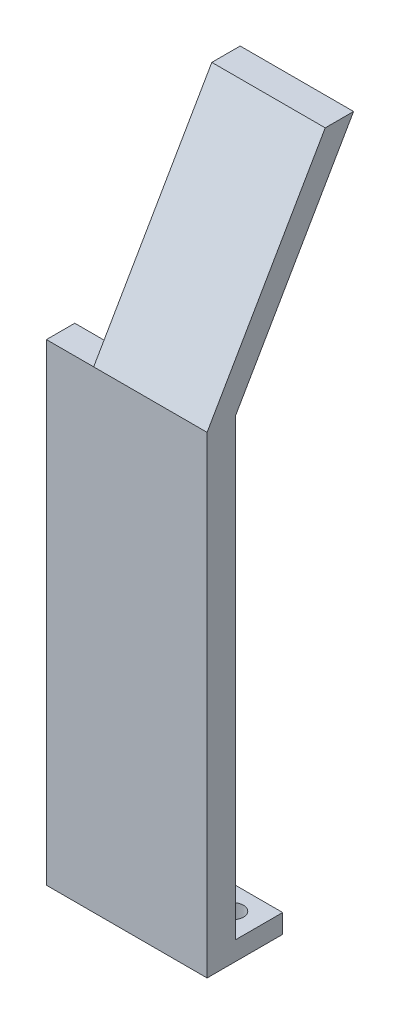
ISO-10303-21;
HEADER;
FILE_DESCRIPTION(('STEP AP214'),'2;1');
FILE_NAME('part.step','',(''),(''),'','','');
FILE_SCHEMA(('AUTOMOTIVE_DESIGN { 1 0 10303 214 1 1 1 1 }'));
ENDSEC;
DATA;
#1=APPLICATION_CONTEXT('core data for automotive mechanical design processes');
#2=APPLICATION_PROTOCOL_DEFINITION('international standard','automotive_design',2000,#1);
#3=PRODUCT_CONTEXT('',#1,'mechanical');
#4=PRODUCT('Part','Part','',(#3));
#5=PRODUCT_RELATED_PRODUCT_CATEGORY('part','',(#4));
#6=PRODUCT_DEFINITION_FORMATION('','',#4);
#7=PRODUCT_DEFINITION_CONTEXT('part definition',#1,'design');
#8=PRODUCT_DEFINITION('design','',#6,#7);
#9=PRODUCT_DEFINITION_SHAPE('','',#8);
#10=(LENGTH_UNIT() NAMED_UNIT(*) SI_UNIT(.MILLI.,.METRE.));
#11=(NAMED_UNIT(*) PLANE_ANGLE_UNIT() SI_UNIT($,.RADIAN.));
#12=(NAMED_UNIT(*) SI_UNIT($,.STERADIAN.) SOLID_ANGLE_UNIT());
#13=UNCERTAINTY_MEASURE_WITH_UNIT(LENGTH_MEASURE(1.E-05),#10,'distance_accuracy_value','');
#14=(GEOMETRIC_REPRESENTATION_CONTEXT(3) GLOBAL_UNCERTAINTY_ASSIGNED_CONTEXT((#13)) GLOBAL_UNIT_ASSIGNED_CONTEXT((#10,
#11,#12)) REPRESENTATION_CONTEXT('',''));
#15=CARTESIAN_POINT('',(0.,0.,0.));
#16=DIRECTION('',(0.,0.,1.));
#17=DIRECTION('',(1.,0.,0.));
#18=AXIS2_PLACEMENT_3D('',#15,#16,#17);
#19=CARTESIAN_POINT('',(0.,2.,0.));
#20=DIRECTION('',(0.,-1.,0.));
#21=DIRECTION('',(0.,0.,-1.));
#22=AXIS2_PLACEMENT_3D('',#19,#20,#21);
#23=PLANE('',#22);
#24=DIRECTION('',(0.,0.,-1.));
#25=VECTOR('',#24,1.);
#26=CARTESIAN_POINT('',(8.5,2.,2.5));
#27=LINE('',#26,#25);
#28=CARTESIAN_POINT('',(8.5,2.,2.5));
#29=VERTEX_POINT('',#28);
#30=CARTESIAN_POINT('',(8.5,2.,-2.5));
#31=VERTEX_POINT('',#30);
#32=EDGE_CURVE('E213',#29,#31,#27,.T.);
#33=ORIENTED_EDGE('',*,*,#32,.T.);
#34=DIRECTION('',(-1.,0.,0.));
#35=VECTOR('',#34,1.);
#36=CARTESIAN_POINT('',(-8.5,2.,-2.5));
#37=LINE('',#36,#35);
#38=CARTESIAN_POINT('',(-8.5,2.,-2.5));
#39=VERTEX_POINT('',#38);
#40=EDGE_CURVE('E81',#31,#39,#37,.T.);
#41=ORIENTED_EDGE('',*,*,#40,.T.);
#42=DIRECTION('',(0.,0.,1.));
#43=VECTOR('',#42,1.);
#44=CARTESIAN_POINT('',(-8.5,2.,2.5));
#45=LINE('',#44,#43);
#46=CARTESIAN_POINT('',(-8.5,2.,2.5));
#47=VERTEX_POINT('',#46);
#48=EDGE_CURVE('E219',#39,#47,#45,.T.);
#49=ORIENTED_EDGE('',*,*,#48,.T.);
#50=DIRECTION('',(1.,0.,0.));
#51=VECTOR('',#50,1.);
#52=CARTESIAN_POINT('',(-8.5,2.,2.5));
#53=LINE('',#52,#51);
#54=EDGE_CURVE('E223',#47,#29,#53,.T.);
#55=ORIENTED_EDGE('',*,*,#54,.T.);
#56=EDGE_LOOP('',(#33,#41,#49,#55));
#57=FACE_BOUND('',#56,.T.);
#58=CARTESIAN_POINT('',(5.75,2.,0.));
#59=DIRECTION('',(0.,1.,0.));
#60=DIRECTION('',(0.,0.,1.));
#61=AXIS2_PLACEMENT_3D('',#58,#59,#60);
#62=CIRCLE('',#61,1.1);
#63=CARTESIAN_POINT('',(5.75,2.,1.1));
#64=VERTEX_POINT('',#63);
#65=EDGE_CURVE('E205',#64,#64,#62,.T.);
#66=ORIENTED_EDGE('',*,*,#65,.F.);
#67=EDGE_LOOP('',(#66));
#68=FACE_BOUND('',#67,.T.);
#69=CARTESIAN_POINT('',(-5.75,2.,0.));
#70=DIRECTION('',(0.,1.,0.));
#71=DIRECTION('',(0.,0.,-1.));
#72=AXIS2_PLACEMENT_3D('',#69,#70,#71);
#73=CIRCLE('',#72,1.1);
#74=CARTESIAN_POINT('',(-5.75,2.,-1.1));
#75=VERTEX_POINT('',#74);
#76=EDGE_CURVE('E197',#75,#75,#73,.T.);
#77=ORIENTED_EDGE('',*,*,#76,.F.);
#78=EDGE_LOOP('',(#77));
#79=FACE_BOUND('',#78,.T.);
#80=CARTESIAN_POINT('',(0.,2.,0.));
#81=DIRECTION('',(0.,1.,0.));
#82=DIRECTION('',(0.,0.,1.));
#83=AXIS2_PLACEMENT_3D('',#80,#81,#82);
#84=CIRCLE('',#83,1.1);
#85=CARTESIAN_POINT('',(0.,2.,1.1));
#86=VERTEX_POINT('',#85);
#87=EDGE_CURVE('E189',#86,#86,#84,.T.);
#88=ORIENTED_EDGE('',*,*,#87,.F.);
#89=EDGE_LOOP('',(#88));
#90=FACE_BOUND('',#89,.T.);
#91=ADVANCED_FACE('F39',(#57,#68,#79,#90),#23,.F.);
#92=CARTESIAN_POINT('',(0.,0.,0.));
#93=DIRECTION('',(0.,-1.,0.));
#94=DIRECTION('',(0.,0.,-1.));
#95=AXIS2_PLACEMENT_3D('',#92,#93,#94);
#96=PLANE('',#95);
#97=CARTESIAN_POINT('',(-5.75,0.,0.));
#98=DIRECTION('',(0.,1.,0.));
#99=DIRECTION('',(0.,0.,-1.));
#100=AXIS2_PLACEMENT_3D('',#97,#98,#99);
#101=CIRCLE('',#100,1.1);
#102=CARTESIAN_POINT('',(-5.75,0.,-1.1));
#103=VERTEX_POINT('',#102);
#104=EDGE_CURVE('E193',#103,#103,#101,.T.);
#105=ORIENTED_EDGE('',*,*,#104,.T.);
#106=EDGE_LOOP('',(#105));
#107=FACE_BOUND('',#106,.T.);
#108=DIRECTION('',(0.,0.,-1.));
#109=VECTOR('',#108,1.);
#110=CARTESIAN_POINT('',(8.5,0.,2.5));
#111=LINE('',#110,#109);
#112=CARTESIAN_POINT('',(8.5,0.,5.5));
#113=VERTEX_POINT('',#112);
#114=CARTESIAN_POINT('',(8.5,0.,-2.5));
#115=VERTEX_POINT('',#114);
#116=EDGE_CURVE('E209',#113,#115,#111,.T.);
#117=ORIENTED_EDGE('',*,*,#116,.F.);
#118=DIRECTION('',(1.,0.,0.));
#119=VECTOR('',#118,1.);
#120=CARTESIAN_POINT('',(8.5,0.,5.5));
#121=LINE('',#120,#119);
#122=CARTESIAN_POINT('',(-8.5,0.,5.5));
#123=VERTEX_POINT('',#122);
#124=EDGE_CURVE('E158',#123,#113,#121,.T.);
#125=ORIENTED_EDGE('',*,*,#124,.F.);
#126=DIRECTION('',(0.,0.,1.));
#127=VECTOR('',#126,1.);
#128=CARTESIAN_POINT('',(-8.5,0.,2.5));
#129=LINE('',#128,#127);
#130=CARTESIAN_POINT('',(-8.5,0.,-2.5));
#131=VERTEX_POINT('',#130);
#132=EDGE_CURVE('E216',#131,#123,#129,.T.);
#133=ORIENTED_EDGE('',*,*,#132,.F.);
#134=DIRECTION('',(-1.,0.,0.));
#135=VECTOR('',#134,1.);
#136=CARTESIAN_POINT('',(-8.5,0.,-2.5));
#137=LINE('',#136,#135);
#138=EDGE_CURVE('E78',#115,#131,#137,.T.);
#139=ORIENTED_EDGE('',*,*,#138,.F.);
#140=EDGE_LOOP('',(#117,#125,#133,#139));
#141=FACE_BOUND('',#140,.T.);
#142=CARTESIAN_POINT('',(5.75,0.,0.));
#143=DIRECTION('',(0.,1.,0.));
#144=DIRECTION('',(0.,0.,1.));
#145=AXIS2_PLACEMENT_3D('',#142,#143,#144);
#146=CIRCLE('',#145,1.1);
#147=CARTESIAN_POINT('',(5.75,0.,1.1));
#148=VERTEX_POINT('',#147);
#149=EDGE_CURVE('E201',#148,#148,#146,.T.);
#150=ORIENTED_EDGE('',*,*,#149,.T.);
#151=EDGE_LOOP('',(#150));
#152=FACE_BOUND('',#151,.T.);
#153=CARTESIAN_POINT('',(0.,0.,0.));
#154=DIRECTION('',(0.,1.,0.));
#155=DIRECTION('',(0.,0.,1.));
#156=AXIS2_PLACEMENT_3D('',#153,#154,#155);
#157=CIRCLE('',#156,1.1);
#158=CARTESIAN_POINT('',(0.,0.,1.1));
#159=VERTEX_POINT('',#158);
#160=EDGE_CURVE('E188',#159,#159,#157,.T.);
#161=ORIENTED_EDGE('',*,*,#160,.T.);
#162=EDGE_LOOP('',(#161));
#163=FACE_BOUND('',#162,.T.);
#164=ADVANCED_FACE('F240',(#107,#141,#152,#163),#96,.T.);
#165=CARTESIAN_POINT('',(8.5,2.,2.5));
#166=DIRECTION('',(-1.,0.,0.));
#167=DIRECTION('',(0.,0.,1.));
#168=AXIS2_PLACEMENT_3D('',#165,#166,#167);
#169=PLANE('',#168);
#170=ORIENTED_EDGE('',*,*,#116,.T.);
#171=DIRECTION('',(0.,-1.,0.));
#172=VECTOR('',#171,1.);
#173=CARTESIAN_POINT('',(8.5,2.,-2.5));
#174=LINE('',#173,#172);
#175=EDGE_CURVE('E11',#31,#115,#174,.T.);
#176=ORIENTED_EDGE('',*,*,#175,.F.);
#177=ORIENTED_EDGE('',*,*,#32,.F.);
#178=DIRECTION('',(0.,-1.,0.));
#179=VECTOR('',#178,1.);
#180=CARTESIAN_POINT('',(8.5,50.,2.5));
#181=LINE('',#180,#179);
#182=CARTESIAN_POINT('',(8.5,50.,2.5));
#183=VERTEX_POINT('',#182);
#184=EDGE_CURVE('E64',#183,#29,#181,.T.);
#185=ORIENTED_EDGE('',*,*,#184,.F.);
#186=DIRECTION('',(0.,0.866025403784442,-0.499999999999995));
#187=VECTOR('',#186,1.);
#188=CARTESIAN_POINT('',(8.5,50.,2.5));
#189=LINE('',#188,#187);
#190=CARTESIAN_POINT('',(8.5,71.650635094611,-9.99999999999987));
#191=VERTEX_POINT('',#190);
#192=EDGE_CURVE('E147',#183,#191,#189,.T.);
#193=ORIENTED_EDGE('',*,*,#192,.T.);
#194=DIRECTION('',(0.,0.,1.));
#195=VECTOR('',#194,1.);
#196=CARTESIAN_POINT('',(8.5,71.650635094611,-6.99999999999987));
#197=LINE('',#196,#195);
#198=CARTESIAN_POINT('',(8.5,71.650635094611,-6.99999999999987));
#199=VERTEX_POINT('',#198);
#200=EDGE_CURVE('E124',#191,#199,#197,.T.);
#201=ORIENTED_EDGE('',*,*,#200,.T.);
#202=DIRECTION('',(0.,-0.866025403784442,0.499999999999995));
#203=VECTOR('',#202,1.);
#204=CARTESIAN_POINT('',(8.5,50.,5.5));
#205=LINE('',#204,#203);
#206=CARTESIAN_POINT('',(8.5,50.,5.5));
#207=VERTEX_POINT('',#206);
#208=EDGE_CURVE('E142',#199,#207,#205,.T.);
#209=ORIENTED_EDGE('',*,*,#208,.T.);
#210=DIRECTION('',(0.,-1.,0.));
#211=VECTOR('',#210,1.);
#212=CARTESIAN_POINT('',(8.5,50.,5.5));
#213=LINE('',#212,#211);
#214=EDGE_CURVE('E176',#207,#113,#213,.T.);
#215=ORIENTED_EDGE('',*,*,#214,.T.);
#216=EDGE_LOOP('',(#170,#176,#177,#185,#193,#201,#209,#215));
#217=FACE_BOUND('',#216,.T.);
#218=ADVANCED_FACE('F41',(#217),#169,.F.);
#219=CARTESIAN_POINT('',(-8.5,2.,-2.5));
#220=DIRECTION('',(0.,0.,1.));
#221=DIRECTION('',(1.,0.,0.));
#222=AXIS2_PLACEMENT_3D('',#219,#220,#221);
#223=PLANE('',#222);
#224=ORIENTED_EDGE('',*,*,#138,.T.);
#225=DIRECTION('',(0.,-1.,0.));
#226=VECTOR('',#225,1.);
#227=CARTESIAN_POINT('',(-8.5,2.,-2.5));
#228=LINE('',#227,#226);
#229=EDGE_CURVE('E48',#39,#131,#228,.T.);
#230=ORIENTED_EDGE('',*,*,#229,.F.);
#231=ORIENTED_EDGE('',*,*,#40,.F.);
#232=ORIENTED_EDGE('',*,*,#175,.T.);
#233=EDGE_LOOP('',(#224,#230,#231,#232));
#234=FACE_BOUND('',#233,.T.);
#235=ADVANCED_FACE('F261',(#234),#223,.F.);
#236=CARTESIAN_POINT('',(-8.5,2.,2.5));
#237=DIRECTION('',(1.,0.,0.));
#238=DIRECTION('',(0.,0.,-1.));
#239=AXIS2_PLACEMENT_3D('',#236,#237,#238);
#240=PLANE('',#239);
#241=ORIENTED_EDGE('',*,*,#132,.T.);
#242=DIRECTION('',(0.,-1.,0.));
#243=VECTOR('',#242,1.);
#244=CARTESIAN_POINT('',(-8.5,50.,5.5));
#245=LINE('',#244,#243);
#246=CARTESIAN_POINT('',(-8.5,50.,5.5));
#247=VERTEX_POINT('',#246);
#248=EDGE_CURVE('E180',#247,#123,#245,.T.);
#249=ORIENTED_EDGE('',*,*,#248,.F.);
#250=DIRECTION('',(0.,0.,1.));
#251=VECTOR('',#250,1.);
#252=CARTESIAN_POINT('',(-8.5,50.,2.5));
#253=LINE('',#252,#251);
#254=CARTESIAN_POINT('',(-8.5,50.,2.5));
#255=VERTEX_POINT('',#254);
#256=EDGE_CURVE('E163',#255,#247,#253,.T.);
#257=ORIENTED_EDGE('',*,*,#256,.F.);
#258=DIRECTION('',(0.,-1.,0.));
#259=VECTOR('',#258,1.);
#260=CARTESIAN_POINT('',(-8.5,50.,2.5));
#261=LINE('',#260,#259);
#262=EDGE_CURVE('E184',#255,#47,#261,.T.);
#263=ORIENTED_EDGE('',*,*,#262,.T.);
#264=ORIENTED_EDGE('',*,*,#48,.F.);
#265=ORIENTED_EDGE('',*,*,#229,.T.);
#266=EDGE_LOOP('',(#241,#249,#257,#263,#264,#265));
#267=FACE_BOUND('',#266,.T.);
#268=ADVANCED_FACE('F236',(#267),#240,.F.);
#269=CARTESIAN_POINT('',(5.75,2.,0.));
#270=DIRECTION('',(0.,-1.,0.));
#271=DIRECTION('',(0.,0.,-1.));
#272=AXIS2_PLACEMENT_3D('',#269,#270,#271);
#273=CYLINDRICAL_SURFACE('',#272,1.1);
#274=ORIENTED_EDGE('',*,*,#65,.T.);
#275=EDGE_LOOP('',(#274));
#276=FACE_BOUND('',#275,.T.);
#277=ORIENTED_EDGE('',*,*,#149,.F.);
#278=EDGE_LOOP('',(#277));
#279=FACE_BOUND('',#278,.T.);
#280=ADVANCED_FACE('F267',(#276,#279),#273,.F.);
#281=CARTESIAN_POINT('',(-5.75,2.,0.));
#282=DIRECTION('',(0.,-1.,0.));
#283=DIRECTION('',(0.,0.,-1.));
#284=AXIS2_PLACEMENT_3D('',#281,#282,#283);
#285=CYLINDRICAL_SURFACE('',#284,1.1);
#286=ORIENTED_EDGE('',*,*,#76,.T.);
#287=EDGE_LOOP('',(#286));
#288=FACE_BOUND('',#287,.T.);
#289=ORIENTED_EDGE('',*,*,#104,.F.);
#290=EDGE_LOOP('',(#289));
#291=FACE_BOUND('',#290,.T.);
#292=ADVANCED_FACE('F279',(#288,#291),#285,.F.);
#293=CARTESIAN_POINT('',(0.,2.,0.));
#294=DIRECTION('',(0.,-1.,0.));
#295=DIRECTION('',(0.,0.,-1.));
#296=AXIS2_PLACEMENT_3D('',#293,#294,#295);
#297=CYLINDRICAL_SURFACE('',#296,1.1);
#298=ORIENTED_EDGE('',*,*,#87,.T.);
#299=EDGE_LOOP('',(#298));
#300=FACE_BOUND('',#299,.T.);
#301=ORIENTED_EDGE('',*,*,#160,.F.);
#302=EDGE_LOOP('',(#301));
#303=FACE_BOUND('',#302,.T.);
#304=ADVANCED_FACE('F283',(#300,#303),#297,.F.);
#305=CARTESIAN_POINT('',(-8.5,50.,2.5));
#306=DIRECTION('',(0.,0.,1.));
#307=DIRECTION('',(1.,0.,0.));
#308=AXIS2_PLACEMENT_3D('',#305,#306,#307);
#309=PLANE('',#308);
#310=ORIENTED_EDGE('',*,*,#54,.F.);
#311=ORIENTED_EDGE('',*,*,#262,.F.);
#312=DIRECTION('',(-1.,0.,0.));
#313=VECTOR('',#312,1.);
#314=CARTESIAN_POINT('',(-8.5,50.,2.5));
#315=LINE('',#314,#313);
#316=CARTESIAN_POINT('',(-3.5,50.,2.5));
#317=VERTEX_POINT('',#316);
#318=EDGE_CURVE('E164',#317,#255,#315,.T.);
#319=ORIENTED_EDGE('',*,*,#318,.F.);
#320=EDGE_CURVE('E136',#183,#317,#315,.T.);
#321=ORIENTED_EDGE('',*,*,#320,.F.);
#322=ORIENTED_EDGE('',*,*,#184,.T.);
#323=EDGE_LOOP('',(#310,#311,#319,#321,#322));
#324=FACE_BOUND('',#323,.T.);
#325=ADVANCED_FACE('F257',(#324),#309,.F.);
#326=CARTESIAN_POINT('',(8.5,50.,5.5));
#327=DIRECTION('',(0.,0.,-1.));
#328=DIRECTION('',(-1.,0.,0.));
#329=AXIS2_PLACEMENT_3D('',#326,#327,#328);
#330=PLANE('',#329);
#331=ORIENTED_EDGE('',*,*,#124,.T.);
#332=ORIENTED_EDGE('',*,*,#214,.F.);
#333=DIRECTION('',(1.,0.,0.));
#334=VECTOR('',#333,1.);
#335=CARTESIAN_POINT('',(-3.5,50.,5.5));
#336=LINE('',#335,#334);
#337=CARTESIAN_POINT('',(-3.5,50.,5.5));
#338=VERTEX_POINT('',#337);
#339=EDGE_CURVE('E155',#338,#207,#336,.T.);
#340=ORIENTED_EDGE('',*,*,#339,.F.);
#341=DIRECTION('',(1.,0.,0.));
#342=VECTOR('',#341,1.);
#343=CARTESIAN_POINT('',(8.5,50.,5.5));
#344=LINE('',#343,#342);
#345=EDGE_CURVE('E167',#247,#338,#344,.T.);
#346=ORIENTED_EDGE('',*,*,#345,.F.);
#347=ORIENTED_EDGE('',*,*,#248,.T.);
#348=EDGE_LOOP('',(#331,#332,#340,#346,#347));
#349=FACE_BOUND('',#348,.T.);
#350=ADVANCED_FACE('F244',(#349),#330,.F.);
#351=CARTESIAN_POINT('',(0.,50.,0.));
#352=DIRECTION('',(0.,-1.,0.));
#353=DIRECTION('',(0.,0.,-1.));
#354=AXIS2_PLACEMENT_3D('',#351,#352,#353);
#355=PLANE('',#354);
#356=ORIENTED_EDGE('',*,*,#345,.T.);
#357=DIRECTION('',(0.,0.,-1.));
#358=VECTOR('',#357,1.);
#359=CARTESIAN_POINT('',(-3.5,50.,5.5));
#360=LINE('',#359,#358);
#361=EDGE_CURVE('E139',#338,#317,#360,.T.);
#362=ORIENTED_EDGE('',*,*,#361,.T.);
#363=ORIENTED_EDGE('',*,*,#318,.T.);
#364=ORIENTED_EDGE('',*,*,#256,.T.);
#365=EDGE_LOOP('',(#356,#362,#363,#364));
#366=FACE_BOUND('',#365,.T.);
#367=ADVANCED_FACE('F253',(#366),#355,.F.);
#368=CARTESIAN_POINT('',(-3.5,50.,5.5));
#369=DIRECTION('',(0.,0.499999999999995,0.866025403784442));
#370=DIRECTION('',(0.,-0.866025403784442,0.499999999999995));
#371=AXIS2_PLACEMENT_3D('',#368,#369,#370);
#372=PLANE('',#371);
#373=ORIENTED_EDGE('',*,*,#208,.F.);
#374=DIRECTION('',(1.,0.,0.));
#375=VECTOR('',#374,1.);
#376=CARTESIAN_POINT('',(-3.5,71.650635094611,-6.99999999999987));
#377=LINE('',#376,#375);
#378=CARTESIAN_POINT('',(-3.5,71.650635094611,-6.99999999999987));
#379=VERTEX_POINT('',#378);
#380=EDGE_CURVE('E128',#379,#199,#377,.T.);
#381=ORIENTED_EDGE('',*,*,#380,.F.);
#382=DIRECTION('',(0.,-0.866025403784442,0.499999999999995));
#383=VECTOR('',#382,1.);
#384=CARTESIAN_POINT('',(-3.5,50.,5.5));
#385=LINE('',#384,#383);
#386=EDGE_CURVE('E129',#379,#338,#385,.T.);
#387=ORIENTED_EDGE('',*,*,#386,.T.);
#388=ORIENTED_EDGE('',*,*,#339,.T.);
#389=EDGE_LOOP('',(#373,#381,#387,#388));
#390=FACE_BOUND('',#389,.T.);
#391=ADVANCED_FACE('F251',(#390),#372,.T.);
#392=CARTESIAN_POINT('',(-3.5,71.650635094611,-6.99999999999987));
#393=DIRECTION('',(0.,1.,0.));
#394=DIRECTION('',(0.,0.,1.));
#395=AXIS2_PLACEMENT_3D('',#392,#393,#394);
#396=PLANE('',#395);
#397=ORIENTED_EDGE('',*,*,#200,.F.);
#398=DIRECTION('',(1.,0.,0.));
#399=VECTOR('',#398,1.);
#400=CARTESIAN_POINT('',(-3.5,71.650635094611,-9.99999999999987));
#401=LINE('',#400,#399);
#402=CARTESIAN_POINT('',(-3.5,71.650635094611,-9.99999999999987));
#403=VERTEX_POINT('',#402);
#404=EDGE_CURVE('E119',#403,#191,#401,.T.);
#405=ORIENTED_EDGE('',*,*,#404,.F.);
#406=DIRECTION('',(0.,0.,1.));
#407=VECTOR('',#406,1.);
#408=CARTESIAN_POINT('',(-3.5,71.650635094611,-6.99999999999987));
#409=LINE('',#408,#407);
#410=EDGE_CURVE('E121',#403,#379,#409,.T.);
#411=ORIENTED_EDGE('',*,*,#410,.T.);
#412=ORIENTED_EDGE('',*,*,#380,.T.);
#413=EDGE_LOOP('',(#397,#405,#411,#412));
#414=FACE_BOUND('',#413,.T.);
#415=ADVANCED_FACE('F120',(#414),#396,.T.);
#416=CARTESIAN_POINT('',(-3.5,50.,2.5));
#417=DIRECTION('',(0.,-0.499999999999995,-0.866025403784442));
#418=DIRECTION('',(0.,0.866025403784442,-0.499999999999995));
#419=AXIS2_PLACEMENT_3D('',#416,#417,#418);
#420=PLANE('',#419);
#421=ORIENTED_EDGE('',*,*,#192,.F.);
#422=ORIENTED_EDGE('',*,*,#320,.T.);
#423=DIRECTION('',(0.,0.866025403784442,-0.499999999999995));
#424=VECTOR('',#423,1.);
#425=CARTESIAN_POINT('',(-3.5,50.,2.5));
#426=LINE('',#425,#424);
#427=EDGE_CURVE('E55',#317,#403,#426,.T.);
#428=ORIENTED_EDGE('',*,*,#427,.T.);
#429=ORIENTED_EDGE('',*,*,#404,.T.);
#430=EDGE_LOOP('',(#421,#422,#428,#429));
#431=FACE_BOUND('',#430,.T.);
#432=ADVANCED_FACE('F135',(#431),#420,.T.);
#433=CARTESIAN_POINT('',(-3.5,0.,0.));
#434=DIRECTION('',(1.,0.,0.));
#435=DIRECTION('',(0.,0.,-1.));
#436=AXIS2_PLACEMENT_3D('',#433,#434,#435);
#437=PLANE('',#436);
#438=ORIENTED_EDGE('',*,*,#361,.F.);
#439=ORIENTED_EDGE('',*,*,#386,.F.);
#440=ORIENTED_EDGE('',*,*,#410,.F.);
#441=ORIENTED_EDGE('',*,*,#427,.F.);
#442=EDGE_LOOP('',(#438,#439,#440,#441));
#443=FACE_BOUND('',#442,.T.);
#444=ADVANCED_FACE('F131',(#443),#437,.F.);
#445=CLOSED_SHELL('',(#91,#164,#218,#235,#268,#280,#292,#304,#325,#350,#367,#391,#415,#432,#444));
#446=MANIFOLD_SOLID_BREP('B2',#445);
#447=ADVANCED_BREP_SHAPE_REPRESENTATION('',(#18,#446),#14);
#448=SHAPE_DEFINITION_REPRESENTATION(#9,#447);
ENDSEC;
END-ISO-10303-21;
